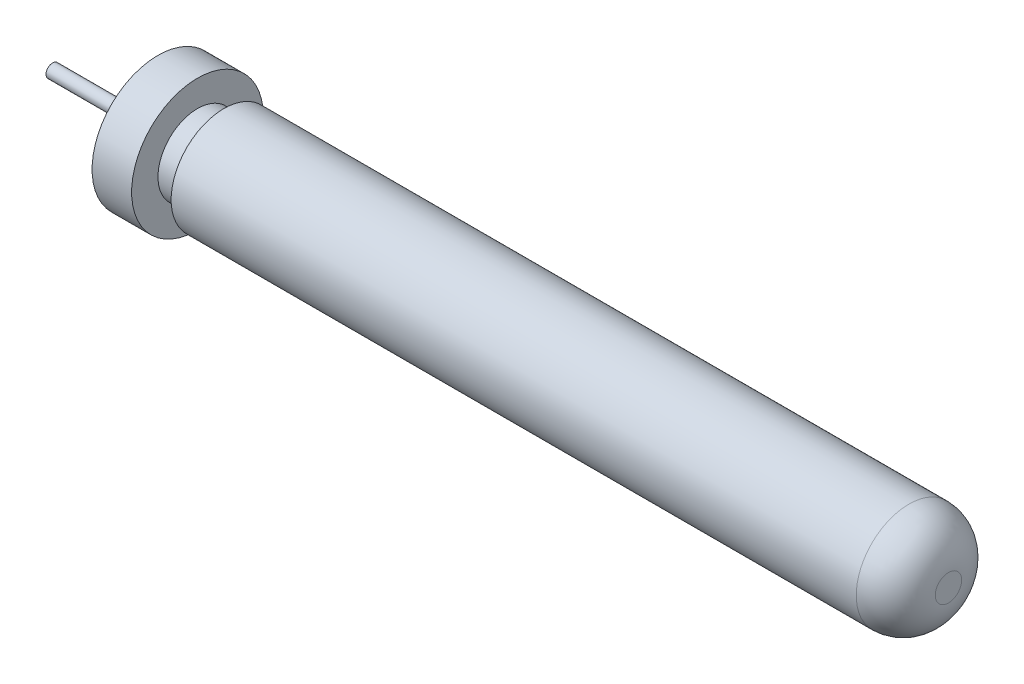
ISO-10303-21;
HEADER;
FILE_DESCRIPTION(('STEP AP214'),'2;1');
FILE_NAME('part.step','',(''),(''),'','','');
FILE_SCHEMA(('AUTOMOTIVE_DESIGN { 1 0 10303 214 1 1 1 1 }'));
ENDSEC;
DATA;
#1=APPLICATION_CONTEXT('core data for automotive mechanical design processes');
#2=APPLICATION_PROTOCOL_DEFINITION('international standard','automotive_design',2000,#1);
#3=PRODUCT_CONTEXT('',#1,'mechanical');
#4=PRODUCT('Part','Part','',(#3));
#5=PRODUCT_RELATED_PRODUCT_CATEGORY('part','',(#4));
#6=PRODUCT_DEFINITION_FORMATION('','',#4);
#7=PRODUCT_DEFINITION_CONTEXT('part definition',#1,'design');
#8=PRODUCT_DEFINITION('design','',#6,#7);
#9=PRODUCT_DEFINITION_SHAPE('','',#8);
#10=(LENGTH_UNIT() NAMED_UNIT(*) SI_UNIT(.MILLI.,.METRE.));
#11=(NAMED_UNIT(*) PLANE_ANGLE_UNIT() SI_UNIT($,.RADIAN.));
#12=(NAMED_UNIT(*) SI_UNIT($,.STERADIAN.) SOLID_ANGLE_UNIT());
#13=UNCERTAINTY_MEASURE_WITH_UNIT(LENGTH_MEASURE(1.E-05),#10,'distance_accuracy_value','');
#14=(GEOMETRIC_REPRESENTATION_CONTEXT(3) GLOBAL_UNCERTAINTY_ASSIGNED_CONTEXT((#13)) GLOBAL_UNIT_ASSIGNED_CONTEXT((#10,
#11,#12)) REPRESENTATION_CONTEXT('',''));
#15=CARTESIAN_POINT('',(0.,0.,0.));
#16=DIRECTION('',(0.,0.,1.));
#17=DIRECTION('',(1.,0.,0.));
#18=AXIS2_PLACEMENT_3D('',#15,#16,#17);
#19=CARTESIAN_POINT('',(0.,0.,0.));
#20=DIRECTION('',(-1.,0.,0.));
#21=DIRECTION('',(0.,0.,1.));
#22=AXIS2_PLACEMENT_3D('',#19,#20,#21);
#23=PLANE('',#22);
#24=CARTESIAN_POINT('',(0.,0.,0.));
#25=DIRECTION('',(1.,0.,0.));
#26=DIRECTION('',(0.,0.,-1.));
#27=AXIS2_PLACEMENT_3D('',#24,#25,#26);
#28=CIRCLE('',#27,0.5);
#29=CARTESIAN_POINT('',(0.,0.,-0.5));
#30=VERTEX_POINT('',#29);
#31=EDGE_CURVE('E42',#30,#30,#28,.T.);
#32=ORIENTED_EDGE('',*,*,#31,.F.);
#33=EDGE_LOOP('',(#32));
#34=FACE_BOUND('',#33,.T.);
#35=ADVANCED_FACE('F31',(#34),#23,.T.);
#36=CARTESIAN_POINT('',(68.,0.,0.));
#37=DIRECTION('',(1.,0.,0.));
#38=DIRECTION('',(0.,0.,-1.));
#39=AXIS2_PLACEMENT_3D('',#36,#37,#38);
#40=CYLINDRICAL_SURFACE('',#39,0.5);
#41=ORIENTED_EDGE('',*,*,#31,.T.);
#42=EDGE_LOOP('',(#41));
#43=FACE_BOUND('',#42,.T.);
#44=CARTESIAN_POINT('',(6.,0.,0.));
#45=DIRECTION('',(1.,0.,0.));
#46=DIRECTION('',(0.,0.,-1.));
#47=AXIS2_PLACEMENT_3D('',#44,#45,#46);
#48=CIRCLE('',#47,0.499999999999999);
#49=CARTESIAN_POINT('',(6.,0.,-0.499999999999999));
#50=VERTEX_POINT('',#49);
#51=EDGE_CURVE('E46',#50,#50,#48,.T.);
#52=ORIENTED_EDGE('',*,*,#51,.F.);
#53=EDGE_LOOP('',(#52));
#54=FACE_BOUND('',#53,.T.);
#55=ADVANCED_FACE('F90',(#43,#54),#40,.T.);
#56=CARTESIAN_POINT('',(6.,1.99999999999999,0.));
#57=DIRECTION('',(-1.,0.,0.));
#58=DIRECTION('',(0.,0.,1.));
#59=AXIS2_PLACEMENT_3D('',#56,#57,#58);
#60=PLANE('',#59);
#61=ORIENTED_EDGE('',*,*,#51,.T.);
#62=EDGE_LOOP('',(#61));
#63=FACE_BOUND('',#62,.T.);
#64=CARTESIAN_POINT('',(6.,0.,0.));
#65=DIRECTION('',(1.,0.,0.));
#66=DIRECTION('',(0.,0.,-1.));
#67=AXIS2_PLACEMENT_3D('',#64,#65,#66);
#68=CIRCLE('',#67,1.99999999999999);
#69=CARTESIAN_POINT('',(6.,0.,-1.99999999999999));
#70=VERTEX_POINT('',#69);
#71=EDGE_CURVE('E51',#70,#70,#68,.T.);
#72=ORIENTED_EDGE('',*,*,#71,.F.);
#73=EDGE_LOOP('',(#72));
#74=FACE_BOUND('',#73,.T.);
#75=ADVANCED_FACE('F95',(#63,#74),#60,.T.);
#76=CARTESIAN_POINT('',(68.,0.,0.));
#77=DIRECTION('',(1.,0.,0.));
#78=DIRECTION('',(0.,0.,-1.));
#79=AXIS2_PLACEMENT_3D('',#76,#77,#78);
#80=CYLINDRICAL_SURFACE('',#79,1.99999999999999);
#81=ORIENTED_EDGE('',*,*,#71,.T.);
#82=EDGE_LOOP('',(#81));
#83=FACE_BOUND('',#82,.T.);
#84=CARTESIAN_POINT('',(8.,0.,0.));
#85=DIRECTION('',(1.,0.,0.));
#86=DIRECTION('',(0.,0.,-1.));
#87=AXIS2_PLACEMENT_3D('',#84,#85,#86);
#88=CIRCLE('',#87,1.99999999999999);
#89=CARTESIAN_POINT('',(8.,0.,-1.99999999999999));
#90=VERTEX_POINT('',#89);
#91=EDGE_CURVE('E54',#90,#90,#88,.T.);
#92=ORIENTED_EDGE('',*,*,#91,.F.);
#93=EDGE_LOOP('',(#92));
#94=FACE_BOUND('',#93,.T.);
#95=ADVANCED_FACE('F102',(#83,#94),#80,.T.);
#96=CARTESIAN_POINT('',(8.,1.99999999999999,0.));
#97=DIRECTION('',(-1.,0.,0.));
#98=DIRECTION('',(0.,0.,1.));
#99=AXIS2_PLACEMENT_3D('',#96,#97,#98);
#100=PLANE('',#99);
#101=ORIENTED_EDGE('',*,*,#91,.T.);
#102=EDGE_LOOP('',(#101));
#103=FACE_BOUND('',#102,.T.);
#104=CARTESIAN_POINT('',(8.,0.,0.));
#105=DIRECTION('',(1.,0.,0.));
#106=DIRECTION('',(0.,0.,-1.));
#107=AXIS2_PLACEMENT_3D('',#104,#105,#106);
#108=CIRCLE('',#107,4.99999999999999);
#109=CARTESIAN_POINT('',(8.,0.,-4.99999999999999));
#110=VERTEX_POINT('',#109);
#111=EDGE_CURVE('E57',#110,#110,#108,.T.);
#112=ORIENTED_EDGE('',*,*,#111,.F.);
#113=EDGE_LOOP('',(#112));
#114=FACE_BOUND('',#113,.T.);
#115=ADVANCED_FACE('F106',(#103,#114),#100,.T.);
#116=CARTESIAN_POINT('',(68.,0.,0.));
#117=DIRECTION('',(1.,0.,0.));
#118=DIRECTION('',(0.,0.,-1.));
#119=AXIS2_PLACEMENT_3D('',#116,#117,#118);
#120=CYLINDRICAL_SURFACE('',#119,4.99999999999999);
#121=ORIENTED_EDGE('',*,*,#111,.T.);
#122=EDGE_LOOP('',(#121));
#123=FACE_BOUND('',#122,.T.);
#124=CARTESIAN_POINT('',(11.,0.,0.));
#125=DIRECTION('',(1.,0.,0.));
#126=DIRECTION('',(0.,0.,-1.));
#127=AXIS2_PLACEMENT_3D('',#124,#125,#126);
#128=CIRCLE('',#127,4.99999999999999);
#129=CARTESIAN_POINT('',(11.,0.,-4.99999999999999));
#130=VERTEX_POINT('',#129);
#131=EDGE_CURVE('E60',#130,#130,#128,.T.);
#132=ORIENTED_EDGE('',*,*,#131,.F.);
#133=EDGE_LOOP('',(#132));
#134=FACE_BOUND('',#133,.T.);
#135=ADVANCED_FACE('F110',(#123,#134),#120,.T.);
#136=CARTESIAN_POINT('',(11.,4.99999999999999,0.));
#137=DIRECTION('',(1.,0.,0.));
#138=DIRECTION('',(0.,0.,-1.));
#139=AXIS2_PLACEMENT_3D('',#136,#137,#138);
#140=PLANE('',#139);
#141=ORIENTED_EDGE('',*,*,#131,.T.);
#142=EDGE_LOOP('',(#141));
#143=FACE_BOUND('',#142,.T.);
#144=CARTESIAN_POINT('',(11.,0.,0.));
#145=DIRECTION('',(1.,0.,0.));
#146=DIRECTION('',(0.,0.,-1.));
#147=AXIS2_PLACEMENT_3D('',#144,#145,#146);
#148=CIRCLE('',#147,2.99999999999999);
#149=CARTESIAN_POINT('',(11.,0.,-2.99999999999999));
#150=VERTEX_POINT('',#149);
#151=EDGE_CURVE('E63',#150,#150,#148,.T.);
#152=ORIENTED_EDGE('',*,*,#151,.F.);
#153=EDGE_LOOP('',(#152));
#154=FACE_BOUND('',#153,.T.);
#155=ADVANCED_FACE('F86',(#143,#154),#140,.T.);
#156=CARTESIAN_POINT('',(68.,0.,0.));
#157=DIRECTION('',(1.,0.,0.));
#158=DIRECTION('',(0.,0.,-1.));
#159=AXIS2_PLACEMENT_3D('',#156,#157,#158);
#160=CYLINDRICAL_SURFACE('',#159,2.99999999999999);
#161=ORIENTED_EDGE('',*,*,#151,.T.);
#162=EDGE_LOOP('',(#161));
#163=FACE_BOUND('',#162,.T.);
#164=CARTESIAN_POINT('',(13.,0.,0.));
#165=DIRECTION('',(1.,0.,0.));
#166=DIRECTION('',(0.,0.,-1.));
#167=AXIS2_PLACEMENT_3D('',#164,#165,#166);
#168=CIRCLE('',#167,2.99999999999999);
#169=CARTESIAN_POINT('',(13.,0.,-2.99999999999999));
#170=VERTEX_POINT('',#169);
#171=EDGE_CURVE('E66',#170,#170,#168,.T.);
#172=ORIENTED_EDGE('',*,*,#171,.F.);
#173=EDGE_LOOP('',(#172));
#174=FACE_BOUND('',#173,.T.);
#175=ADVANCED_FACE('F77',(#163,#174),#160,.T.);
#176=CARTESIAN_POINT('',(13.,2.99999999999999,0.));
#177=DIRECTION('',(-1.,0.,0.));
#178=DIRECTION('',(0.,0.,1.));
#179=AXIS2_PLACEMENT_3D('',#176,#177,#178);
#180=PLANE('',#179);
#181=ORIENTED_EDGE('',*,*,#171,.T.);
#182=EDGE_LOOP('',(#181));
#183=FACE_BOUND('',#182,.T.);
#184=CARTESIAN_POINT('',(13.,0.,0.));
#185=DIRECTION('',(1.,0.,0.));
#186=DIRECTION('',(0.,0.,-1.));
#187=AXIS2_PLACEMENT_3D('',#184,#185,#186);
#188=CIRCLE('',#187,3.99999999999999);
#189=CARTESIAN_POINT('',(13.,0.,-3.99999999999999));
#190=VERTEX_POINT('',#189);
#191=EDGE_CURVE('E69',#190,#190,#188,.T.);
#192=ORIENTED_EDGE('',*,*,#191,.F.);
#193=EDGE_LOOP('',(#192));
#194=FACE_BOUND('',#193,.T.);
#195=ADVANCED_FACE('F75',(#183,#194),#180,.T.);
#196=CARTESIAN_POINT('',(68.,0.,0.));
#197=DIRECTION('',(1.,0.,0.));
#198=DIRECTION('',(0.,0.,-1.));
#199=AXIS2_PLACEMENT_3D('',#196,#197,#198);
#200=CYLINDRICAL_SURFACE('',#199,3.99999999999999);
#201=CARTESIAN_POINT('',(65.,0.,0.));
#202=DIRECTION('',(1.,0.,0.));
#203=DIRECTION('',(0.,0.,-1.));
#204=AXIS2_PLACEMENT_3D('',#201,#202,#203);
#205=CIRCLE('',#204,3.99999999999999);
#206=CARTESIAN_POINT('',(65.,0.,-3.99999999999999));
#207=VERTEX_POINT('',#206);
#208=EDGE_CURVE('E10',#207,#207,#205,.F.);
#209=ORIENTED_EDGE('',*,*,#208,.T.);
#210=EDGE_LOOP('',(#209));
#211=FACE_BOUND('',#210,.T.);
#212=ORIENTED_EDGE('',*,*,#191,.T.);
#213=EDGE_LOOP('',(#212));
#214=FACE_BOUND('',#213,.T.);
#215=ADVANCED_FACE('F73',(#211,#214),#200,.T.);
#216=CARTESIAN_POINT('',(68.,3.99999999999999,0.));
#217=DIRECTION('',(1.,0.,0.));
#218=DIRECTION('',(0.,0.,-1.));
#219=AXIS2_PLACEMENT_3D('',#216,#217,#218);
#220=PLANE('',#219);
#221=CARTESIAN_POINT('',(68.,0.,0.));
#222=DIRECTION('',(1.,0.,0.));
#223=DIRECTION('',(0.,0.,-1.));
#224=AXIS2_PLACEMENT_3D('',#221,#222,#223);
#225=CIRCLE('',#224,0.999999999999993);
#226=CARTESIAN_POINT('',(68.,0.,-0.999999999999993));
#227=VERTEX_POINT('',#226);
#228=EDGE_CURVE('E38',#227,#227,#225,.T.);
#229=ORIENTED_EDGE('',*,*,#228,.T.);
#230=EDGE_LOOP('',(#229));
#231=FACE_BOUND('',#230,.T.);
#232=ADVANCED_FACE('F84',(#231),#220,.T.);
#233=CARTESIAN_POINT('',(65.,0.,0.));
#234=DIRECTION('',(1.,0.,0.));
#235=DIRECTION('',(0.,0.,-1.));
#236=AXIS2_PLACEMENT_3D('',#233,#234,#235);
#237=DEGENERATE_TOROIDAL_SURFACE('',#236,0.999999999999993,3.,.T.);
#238=ORIENTED_EDGE('',*,*,#208,.F.);
#239=EDGE_LOOP('',(#238));
#240=FACE_BOUND('',#239,.T.);
#241=ORIENTED_EDGE('',*,*,#228,.F.);
#242=EDGE_LOOP('',(#241));
#243=FACE_BOUND('',#242,.T.);
#244=ADVANCED_FACE('F33',(#240,#243),#237,.T.);
#245=CLOSED_SHELL('',(#35,#55,#75,#95,#115,#135,#155,#175,#195,#215,#232,#244));
#246=MANIFOLD_SOLID_BREP('B2',#245);
#247=ADVANCED_BREP_SHAPE_REPRESENTATION('',(#18,#246),#14);
#248=SHAPE_DEFINITION_REPRESENTATION(#9,#247);
ENDSEC;
END-ISO-10303-21;
